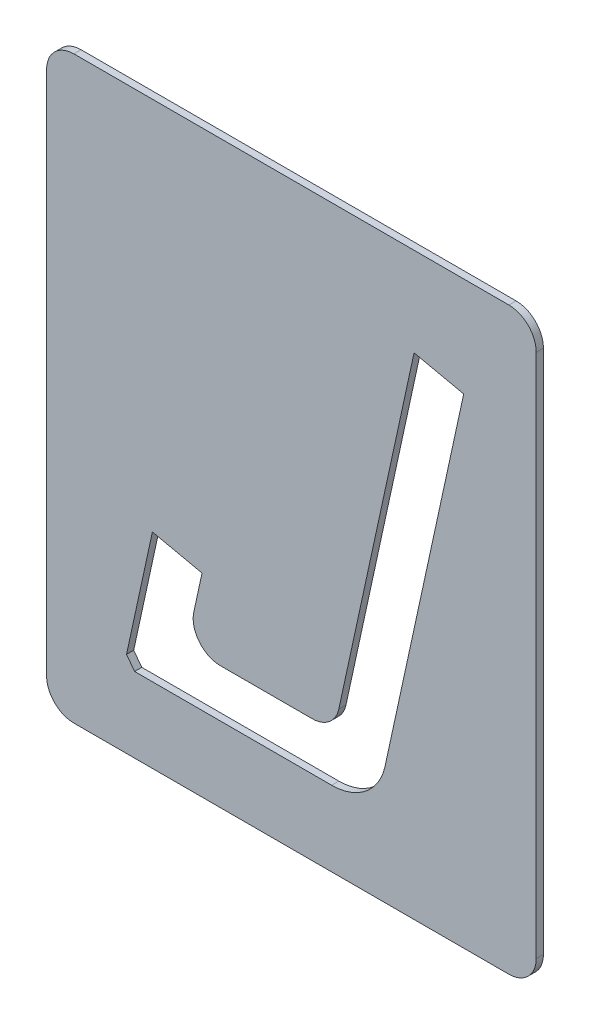
ISO-10303-21;
HEADER;
FILE_DESCRIPTION(('STEP AP214'),'2;1');
FILE_NAME('part.step','',(''),(''),'','','');
FILE_SCHEMA(('AUTOMOTIVE_DESIGN { 1 0 10303 214 1 1 1 1 }'));
ENDSEC;
DATA;
#1=APPLICATION_CONTEXT('core data for automotive mechanical design processes');
#2=APPLICATION_PROTOCOL_DEFINITION('international standard','automotive_design',2000,#1);
#3=PRODUCT_CONTEXT('',#1,'mechanical');
#4=PRODUCT('Part','Part','',(#3));
#5=PRODUCT_RELATED_PRODUCT_CATEGORY('part','',(#4));
#6=PRODUCT_DEFINITION_FORMATION('','',#4);
#7=PRODUCT_DEFINITION_CONTEXT('part definition',#1,'design');
#8=PRODUCT_DEFINITION('design','',#6,#7);
#9=PRODUCT_DEFINITION_SHAPE('','',#8);
#10=(LENGTH_UNIT() NAMED_UNIT(*) SI_UNIT(.MILLI.,.METRE.));
#11=(NAMED_UNIT(*) PLANE_ANGLE_UNIT() SI_UNIT($,.RADIAN.));
#12=(NAMED_UNIT(*) SI_UNIT($,.STERADIAN.) SOLID_ANGLE_UNIT());
#13=UNCERTAINTY_MEASURE_WITH_UNIT(LENGTH_MEASURE(1.E-05),#10,'distance_accuracy_value','');
#14=(GEOMETRIC_REPRESENTATION_CONTEXT(3) GLOBAL_UNCERTAINTY_ASSIGNED_CONTEXT((#13)) GLOBAL_UNIT_ASSIGNED_CONTEXT((#10,
#11,#12)) REPRESENTATION_CONTEXT('',''));
#15=CARTESIAN_POINT('',(0.,0.,0.));
#16=DIRECTION('',(0.,0.,1.));
#17=DIRECTION('',(1.,0.,0.));
#18=AXIS2_PLACEMENT_3D('',#15,#16,#17);
#19=CARTESIAN_POINT('',(1.915046057981,-4.069522192612,0.));
#20=DIRECTION('',(0.,0.,1.));
#21=DIRECTION('',(1.,0.,0.));
#22=AXIS2_PLACEMENT_3D('',#19,#20,#21);
#23=PLANE('',#22);
#24=DIRECTION('',(-0.212429649393078,-0.977176362822359,0.));
#25=VECTOR('',#24,1.);
#26=CARTESIAN_POINT('',(1.721180043788,-4.188048160548,0.));
#27=LINE('',#26,#25);
#28=CARTESIAN_POINT('',(1.72118004378802,-4.18804816054789,0.));
#29=VERTEX_POINT('',#28);
#30=CARTESIAN_POINT('',(1.68512443925918,-4.35390393723904,0.));
#31=VERTEX_POINT('',#30);
#32=EDGE_CURVE('E220',#29,#31,#27,.T.);
#33=ORIENTED_EDGE('',*,*,#32,.T.);
#34=DIRECTION('',(0.598473967642059,-0.801142253320078,0.));
#35=VECTOR('',#34,1.);
#36=CARTESIAN_POINT('',(1.685124439259,-4.353903937239,0.));
#37=LINE('',#36,#35);
#38=CARTESIAN_POINT('',(1.69636514961494,-4.36895122168303,0.));
#39=VERTEX_POINT('',#38);
#40=EDGE_CURVE('E264',#31,#39,#37,.T.);
#41=ORIENTED_EDGE('',*,*,#40,.T.);
#42=DIRECTION('',(1.,0.,0.));
#43=VECTOR('',#42,1.);
#44=CARTESIAN_POINT('',(1.696365149615,-4.368951221683,0.));
#45=LINE('',#44,#43);
#46=CARTESIAN_POINT('',(1.971141509953,-4.368951221683,0.));
#47=VERTEX_POINT('',#46);
#48=EDGE_CURVE('E258',#39,#47,#45,.T.);
#49=ORIENTED_EDGE('',*,*,#48,.T.);
#50=CARTESIAN_POINT('',(1.971141509953,-4.292751221683,0.));
#51=DIRECTION('',(0.,0.,1.));
#52=DIRECTION('',(1.,0.,0.));
#53=AXIS2_PLACEMENT_3D('',#50,#51,#52);
#54=CIRCLE('',#53,0.0762);
#55=CARTESIAN_POINT('',(2.04560234880003,-4.30893836096638,0.));
#56=VERTEX_POINT('',#55);
#57=EDGE_CURVE('E221',#47,#56,#54,.T.);
#58=ORIENTED_EDGE('',*,*,#57,.T.);
#59=DIRECTION('',(0.212429649393078,0.977176362822359,0.));
#60=VECTOR('',#59,1.);
#61=CARTESIAN_POINT('',(2.0456023488,-4.308938360966,0.));
#62=LINE('',#61,#60);
#63=CARTESIAN_POINT('',(2.15529760165584,-3.80434021042197,0.));
#64=VERTEX_POINT('',#63);
#65=EDGE_CURVE('E269',#56,#64,#62,.T.);
#66=ORIENTED_EDGE('',*,*,#65,.T.);
#67=DIRECTION('',(-0.977176362822359,0.212429649393078,0.));
#68=VECTOR('',#67,1.);
#69=CARTESIAN_POINT('',(2.155297601656,-3.804340210422,0.));
#70=LINE('',#69,#68);
#71=CARTESIAN_POINT('',(2.08608009494308,-3.78929292597865,0.));
#72=VERTEX_POINT('',#71);
#73=EDGE_CURVE('E275',#64,#72,#70,.T.);
#74=ORIENTED_EDGE('',*,*,#73,.T.);
#75=DIRECTION('',(-0.212429649393078,-0.977176362822359,0.));
#76=VECTOR('',#75,1.);
#77=CARTESIAN_POINT('',(2.086080094943,-3.789292925979,0.));
#78=LINE('',#77,#76);
#79=CARTESIAN_POINT('',(1.98110241524555,-4.27219024053639,0.));
#80=VERTEX_POINT('',#79);
#81=EDGE_CURVE('E281',#72,#80,#78,.T.);
#82=ORIENTED_EDGE('',*,*,#81,.T.);
#83=CARTESIAN_POINT('',(1.943871995822,-4.264096670895,0.));
#84=DIRECTION('',(0.,0.,1.));
#85=DIRECTION('',(1.,0.,0.));
#86=AXIS2_PLACEMENT_3D('',#83,#84,#85);
#87=CIRCLE('',#86,0.0381);
#88=CARTESIAN_POINT('',(1.943871995822,-4.302196670895,0.));
#89=VERTEX_POINT('',#88);
#90=EDGE_CURVE('E226',#89,#80,#87,.T.);
#91=ORIENTED_EDGE('',*,*,#90,.F.);
#92=DIRECTION('',(1.,0.,0.));
#93=VECTOR('',#92,1.);
#94=CARTESIAN_POINT('',(1.943871995822,-4.302196670895,0.));
#95=LINE('',#94,#93);
#96=CARTESIAN_POINT('',(1.816126305232,-4.302196670895,0.));
#97=VERTEX_POINT('',#96);
#98=EDGE_CURVE('E229',#89,#97,#95,.F.);
#99=ORIENTED_EDGE('',*,*,#98,.T.);
#100=CARTESIAN_POINT('',(1.816126305232,-4.264096670895,0.));
#101=DIRECTION('',(0.,0.,1.));
#102=DIRECTION('',(1.,0.,0.));
#103=AXIS2_PLACEMENT_3D('',#100,#101,#102);
#104=CIRCLE('',#103,0.0381);
#105=CARTESIAN_POINT('',(1.77889588580823,-4.25600310125306,0.));
#106=VERTEX_POINT('',#105);
#107=EDGE_CURVE('E230',#106,#97,#104,.T.);
#108=ORIENTED_EDGE('',*,*,#107,.F.);
#109=DIRECTION('',(0.212429649393078,0.977176362822359,0.));
#110=VECTOR('',#109,1.);
#111=CARTESIAN_POINT('',(1.778895885808,-4.256003101253,0.));
#112=LINE('',#111,#110);
#113=CARTESIAN_POINT('',(1.79039755049988,-4.20309544499097,0.));
#114=VERTEX_POINT('',#113);
#115=EDGE_CURVE('E233',#106,#114,#112,.T.);
#116=ORIENTED_EDGE('',*,*,#115,.T.);
#117=DIRECTION('',(-0.977176362822359,0.212429649393078,0.));
#118=VECTOR('',#117,1.);
#119=CARTESIAN_POINT('',(1.7903975505,-4.203095444991,0.));
#120=LINE('',#119,#118);
#121=EDGE_CURVE('E248',#114,#29,#120,.T.);
#122=ORIENTED_EDGE('',*,*,#121,.T.);
#123=EDGE_LOOP('',(#33,#41,#49,#58,#66,#74,#82,#91,#99,#108,#116,#122));
#124=FACE_BOUND('',#123,.T.);
#125=DIRECTION('',(1.,0.,0.));
#126=VECTOR('',#125,1.);
#127=CARTESIAN_POINT('',(2.21837797732,-3.66537829581,0.));
#128=LINE('',#127,#126);
#129=CARTESIAN_POINT('',(2.21837797732,-3.66537829581,0.));
#130=VERTEX_POINT('',#129);
#131=CARTESIAN_POINT('',(1.611714138642,-3.66537829581,0.));
#132=VERTEX_POINT('',#131);
#133=EDGE_CURVE('E153',#130,#132,#128,.F.);
#134=ORIENTED_EDGE('',*,*,#133,.F.);
#135=CARTESIAN_POINT('',(2.21837797732,-3.70347829581,0.));
#136=DIRECTION('',(0.,0.,1.));
#137=DIRECTION('',(1.,0.,0.));
#138=AXIS2_PLACEMENT_3D('',#135,#136,#137);
#139=CIRCLE('',#138,0.0381);
#140=CARTESIAN_POINT('',(2.25647797732,-3.70347829581,0.));
#141=VERTEX_POINT('',#140);
#142=EDGE_CURVE('E174',#141,#130,#139,.T.);
#143=ORIENTED_EDGE('',*,*,#142,.F.);
#144=DIRECTION('',(0.,1.,0.));
#145=VECTOR('',#144,1.);
#146=CARTESIAN_POINT('',(2.25647797732,-4.435566089415,0.));
#147=LINE('',#146,#145);
#148=CARTESIAN_POINT('',(2.25647797732,-4.435566089415,0.));
#149=VERTEX_POINT('',#148);
#150=EDGE_CURVE('E180',#149,#141,#147,.T.);
#151=ORIENTED_EDGE('',*,*,#150,.F.);
#152=CARTESIAN_POINT('',(2.21837797732,-4.435566089415,0.));
#153=DIRECTION('',(0.,0.,1.));
#154=DIRECTION('',(1.,0.,0.));
#155=AXIS2_PLACEMENT_3D('',#152,#153,#154);
#156=CIRCLE('',#155,0.0381);
#157=CARTESIAN_POINT('',(2.21837797732,-4.473666089415,0.));
#158=VERTEX_POINT('',#157);
#159=EDGE_CURVE('E235',#158,#149,#156,.T.);
#160=ORIENTED_EDGE('',*,*,#159,.F.);
#161=DIRECTION('',(1.,0.,0.));
#162=VECTOR('',#161,1.);
#163=CARTESIAN_POINT('',(1.611714138642,-4.473666089415,0.));
#164=LINE('',#163,#162);
#165=CARTESIAN_POINT('',(1.611714138642,-4.473666089415,0.));
#166=VERTEX_POINT('',#165);
#167=EDGE_CURVE('E185',#166,#158,#164,.T.);
#168=ORIENTED_EDGE('',*,*,#167,.F.);
#169=CARTESIAN_POINT('',(1.611714138642,-4.435566089415,0.));
#170=DIRECTION('',(0.,0.,1.));
#171=DIRECTION('',(1.,0.,0.));
#172=AXIS2_PLACEMENT_3D('',#169,#170,#171);
#173=CIRCLE('',#172,0.0381);
#174=CARTESIAN_POINT('',(1.573614138642,-4.435566089415,0.));
#175=VERTEX_POINT('',#174);
#176=EDGE_CURVE('E237',#175,#166,#173,.T.);
#177=ORIENTED_EDGE('',*,*,#176,.F.);
#178=DIRECTION('',(0.,1.,0.));
#179=VECTOR('',#178,1.);
#180=CARTESIAN_POINT('',(1.573614138642,-3.70347829581,0.));
#181=LINE('',#180,#179);
#182=CARTESIAN_POINT('',(1.573614138642,-3.70347829581,0.));
#183=VERTEX_POINT('',#182);
#184=EDGE_CURVE('E156',#183,#175,#181,.F.);
#185=ORIENTED_EDGE('',*,*,#184,.F.);
#186=CARTESIAN_POINT('',(1.611714138642,-3.70347829581,0.));
#187=DIRECTION('',(0.,0.,1.));
#188=DIRECTION('',(1.,0.,0.));
#189=AXIS2_PLACEMENT_3D('',#186,#187,#188);
#190=CIRCLE('',#189,0.0381);
#191=EDGE_CURVE('E20',#132,#183,#190,.T.);
#192=ORIENTED_EDGE('',*,*,#191,.F.);
#193=EDGE_LOOP('',(#134,#143,#151,#160,#168,#177,#185,#192));
#194=FACE_BOUND('',#193,.T.);
#195=ADVANCED_FACE('F17',(#124,#194),#23,.F.);
#196=CARTESIAN_POINT('',(1.611714138642,-3.70347829581,0.));
#197=DIRECTION('',(0.,0.,1.));
#198=DIRECTION('',(1.,0.,0.));
#199=AXIS2_PLACEMENT_3D('',#196,#197,#198);
#200=CYLINDRICAL_SURFACE('',#199,0.0381);
#201=CARTESIAN_POINT('',(1.611714138642,-3.70347829581,0.01));
#202=DIRECTION('',(0.,0.,1.));
#203=DIRECTION('',(1.,0.,0.));
#204=AXIS2_PLACEMENT_3D('',#201,#202,#203);
#205=CIRCLE('',#204,0.0381);
#206=CARTESIAN_POINT('',(1.611714138642,-3.66537829581,0.01));
#207=VERTEX_POINT('',#206);
#208=CARTESIAN_POINT('',(1.573614138642,-3.70347829581,0.01));
#209=VERTEX_POINT('',#208);
#210=EDGE_CURVE('E163',#207,#209,#205,.T.);
#211=ORIENTED_EDGE('',*,*,#210,.F.);
#212=DIRECTION('',(0.,0.,1.));
#213=VECTOR('',#212,1.);
#214=CARTESIAN_POINT('',(1.611714138642,-3.66537829581,0.));
#215=LINE('',#214,#213);
#216=EDGE_CURVE('E160',#132,#207,#215,.T.);
#217=ORIENTED_EDGE('',*,*,#216,.F.);
#218=ORIENTED_EDGE('',*,*,#191,.T.);
#219=DIRECTION('',(0.,0.,1.));
#220=VECTOR('',#219,1.);
#221=CARTESIAN_POINT('',(1.573614138642,-3.70347829581,0.));
#222=LINE('',#221,#220);
#223=EDGE_CURVE('E191',#209,#183,#222,.F.);
#224=ORIENTED_EDGE('',*,*,#223,.F.);
#225=EDGE_LOOP('',(#211,#217,#218,#224));
#226=FACE_BOUND('',#225,.T.);
#227=ADVANCED_FACE('F161',(#226),#200,.T.);
#228=CARTESIAN_POINT('',(1.573614138642,-3.70347829581,0.));
#229=DIRECTION('',(-1.,0.,0.));
#230=DIRECTION('',(0.,0.,1.));
#231=AXIS2_PLACEMENT_3D('',#228,#229,#230);
#232=PLANE('',#231);
#233=DIRECTION('',(0.,1.,0.));
#234=VECTOR('',#233,1.);
#235=CARTESIAN_POINT('',(1.573614138642,-4.069522192612,0.01));
#236=LINE('',#235,#234);
#237=CARTESIAN_POINT('',(1.573614138642,-4.435566089415,0.01));
#238=VERTEX_POINT('',#237);
#239=EDGE_CURVE('E218',#209,#238,#236,.F.);
#240=ORIENTED_EDGE('',*,*,#239,.F.);
#241=ORIENTED_EDGE('',*,*,#223,.T.);
#242=ORIENTED_EDGE('',*,*,#184,.T.);
#243=DIRECTION('',(0.,0.,1.));
#244=VECTOR('',#243,1.);
#245=CARTESIAN_POINT('',(1.573614138642,-4.435566089415,0.));
#246=LINE('',#245,#244);
#247=EDGE_CURVE('E189',#238,#175,#246,.F.);
#248=ORIENTED_EDGE('',*,*,#247,.F.);
#249=EDGE_LOOP('',(#240,#241,#242,#248));
#250=FACE_BOUND('',#249,.T.);
#251=ADVANCED_FACE('F574',(#250),#232,.T.);
#252=CARTESIAN_POINT('',(1.611714138642,-4.435566089415,0.));
#253=DIRECTION('',(0.,0.,1.));
#254=DIRECTION('',(1.,0.,0.));
#255=AXIS2_PLACEMENT_3D('',#252,#253,#254);
#256=CYLINDRICAL_SURFACE('',#255,0.0381);
#257=CARTESIAN_POINT('',(1.611714138642,-4.435566089415,0.01));
#258=DIRECTION('',(0.,0.,1.));
#259=DIRECTION('',(1.,0.,0.));
#260=AXIS2_PLACEMENT_3D('',#257,#258,#259);
#261=CIRCLE('',#260,0.0381);
#262=CARTESIAN_POINT('',(1.611714138642,-4.473666089415,0.01));
#263=VERTEX_POINT('',#262);
#264=EDGE_CURVE('E215',#238,#263,#261,.T.);
#265=ORIENTED_EDGE('',*,*,#264,.F.);
#266=ORIENTED_EDGE('',*,*,#247,.T.);
#267=ORIENTED_EDGE('',*,*,#176,.T.);
#268=DIRECTION('',(0.,0.,-1.));
#269=VECTOR('',#268,1.);
#270=CARTESIAN_POINT('',(1.611714138642,-4.473666089415,0.));
#271=LINE('',#270,#269);
#272=EDGE_CURVE('E188',#263,#166,#271,.T.);
#273=ORIENTED_EDGE('',*,*,#272,.F.);
#274=EDGE_LOOP('',(#265,#266,#267,#273));
#275=FACE_BOUND('',#274,.T.);
#276=ADVANCED_FACE('F321',(#275),#256,.T.);
#277=CARTESIAN_POINT('',(1.611714138642,-4.473666089415,0.));
#278=DIRECTION('',(0.,-1.,0.));
#279=DIRECTION('',(0.,0.,-1.));
#280=AXIS2_PLACEMENT_3D('',#277,#278,#279);
#281=PLANE('',#280);
#282=DIRECTION('',(1.,0.,0.));
#283=VECTOR('',#282,1.);
#284=CARTESIAN_POINT('',(1.915046057981,-4.473666089415,0.01));
#285=LINE('',#284,#283);
#286=CARTESIAN_POINT('',(2.21837797732,-4.473666089415,0.01));
#287=VERTEX_POINT('',#286);
#288=EDGE_CURVE('E214',#263,#287,#285,.T.);
#289=ORIENTED_EDGE('',*,*,#288,.F.);
#290=ORIENTED_EDGE('',*,*,#272,.T.);
#291=ORIENTED_EDGE('',*,*,#167,.T.);
#292=DIRECTION('',(0.,0.,1.));
#293=VECTOR('',#292,1.);
#294=CARTESIAN_POINT('',(2.21837797732,-4.473666089415,0.));
#295=LINE('',#294,#293);
#296=EDGE_CURVE('E184',#287,#158,#295,.F.);
#297=ORIENTED_EDGE('',*,*,#296,.F.);
#298=EDGE_LOOP('',(#289,#290,#291,#297));
#299=FACE_BOUND('',#298,.T.);
#300=ADVANCED_FACE('F318',(#299),#281,.T.);
#301=CARTESIAN_POINT('',(2.21837797732,-4.435566089415,0.));
#302=DIRECTION('',(0.,0.,1.));
#303=DIRECTION('',(1.,0.,0.));
#304=AXIS2_PLACEMENT_3D('',#301,#302,#303);
#305=CYLINDRICAL_SURFACE('',#304,0.0381);
#306=CARTESIAN_POINT('',(2.21837797732,-4.435566089415,0.01));
#307=DIRECTION('',(0.,0.,1.));
#308=DIRECTION('',(1.,0.,0.));
#309=AXIS2_PLACEMENT_3D('',#306,#307,#308);
#310=CIRCLE('',#309,0.0381);
#311=CARTESIAN_POINT('',(2.25647797732,-4.435566089415,0.01));
#312=VERTEX_POINT('',#311);
#313=EDGE_CURVE('E211',#287,#312,#310,.T.);
#314=ORIENTED_EDGE('',*,*,#313,.F.);
#315=ORIENTED_EDGE('',*,*,#296,.T.);
#316=ORIENTED_EDGE('',*,*,#159,.T.);
#317=DIRECTION('',(0.,0.,-1.));
#318=VECTOR('',#317,1.);
#319=CARTESIAN_POINT('',(2.25647797732,-4.435566089415,0.));
#320=LINE('',#319,#318);
#321=EDGE_CURVE('E183',#312,#149,#320,.T.);
#322=ORIENTED_EDGE('',*,*,#321,.F.);
#323=EDGE_LOOP('',(#314,#315,#316,#322));
#324=FACE_BOUND('',#323,.T.);
#325=ADVANCED_FACE('F416',(#324),#305,.T.);
#326=CARTESIAN_POINT('',(2.25647797732,-4.435566089415,0.));
#327=DIRECTION('',(1.,0.,0.));
#328=DIRECTION('',(0.,0.,-1.));
#329=AXIS2_PLACEMENT_3D('',#326,#327,#328);
#330=PLANE('',#329);
#331=DIRECTION('',(0.,1.,0.));
#332=VECTOR('',#331,1.);
#333=CARTESIAN_POINT('',(2.25647797732,-4.069522192612,0.01));
#334=LINE('',#333,#332);
#335=CARTESIAN_POINT('',(2.25647797732,-3.70347829581,0.01));
#336=VERTEX_POINT('',#335);
#337=EDGE_CURVE('E210',#312,#336,#334,.T.);
#338=ORIENTED_EDGE('',*,*,#337,.F.);
#339=ORIENTED_EDGE('',*,*,#321,.T.);
#340=ORIENTED_EDGE('',*,*,#150,.T.);
#341=DIRECTION('',(0.,0.,1.));
#342=VECTOR('',#341,1.);
#343=CARTESIAN_POINT('',(2.25647797732,-3.70347829581,0.));
#344=LINE('',#343,#342);
#345=EDGE_CURVE('E171',#336,#141,#344,.F.);
#346=ORIENTED_EDGE('',*,*,#345,.F.);
#347=EDGE_LOOP('',(#338,#339,#340,#346));
#348=FACE_BOUND('',#347,.T.);
#349=ADVANCED_FACE('F412',(#348),#330,.T.);
#350=CARTESIAN_POINT('',(2.21837797732,-3.70347829581,0.));
#351=DIRECTION('',(0.,0.,1.));
#352=DIRECTION('',(1.,0.,0.));
#353=AXIS2_PLACEMENT_3D('',#350,#351,#352);
#354=CYLINDRICAL_SURFACE('',#353,0.0381);
#355=CARTESIAN_POINT('',(2.21837797732,-3.70347829581,0.01));
#356=DIRECTION('',(0.,0.,1.));
#357=DIRECTION('',(1.,0.,0.));
#358=AXIS2_PLACEMENT_3D('',#355,#356,#357);
#359=CIRCLE('',#358,0.0381);
#360=CARTESIAN_POINT('',(2.21837797732,-3.66537829581,0.01));
#361=VERTEX_POINT('',#360);
#362=EDGE_CURVE('E206',#336,#361,#359,.T.);
#363=ORIENTED_EDGE('',*,*,#362,.F.);
#364=ORIENTED_EDGE('',*,*,#345,.T.);
#365=ORIENTED_EDGE('',*,*,#142,.T.);
#366=DIRECTION('',(0.,0.,1.));
#367=VECTOR('',#366,1.);
#368=CARTESIAN_POINT('',(2.21837797732,-3.66537829581,0.));
#369=LINE('',#368,#367);
#370=EDGE_CURVE('E167',#361,#130,#369,.F.);
#371=ORIENTED_EDGE('',*,*,#370,.F.);
#372=EDGE_LOOP('',(#363,#364,#365,#371));
#373=FACE_BOUND('',#372,.T.);
#374=ADVANCED_FACE('F414',(#373),#354,.T.);
#375=CARTESIAN_POINT('',(2.21837797732,-3.66537829581,0.));
#376=DIRECTION('',(0.,1.,0.));
#377=DIRECTION('',(0.,0.,1.));
#378=AXIS2_PLACEMENT_3D('',#375,#376,#377);
#379=PLANE('',#378);
#380=DIRECTION('',(1.,0.,0.));
#381=VECTOR('',#380,1.);
#382=CARTESIAN_POINT('',(1.915046057981,-3.66537829581,0.01));
#383=LINE('',#382,#381);
#384=EDGE_CURVE('E209',#361,#207,#383,.F.);
#385=ORIENTED_EDGE('',*,*,#384,.F.);
#386=ORIENTED_EDGE('',*,*,#370,.T.);
#387=ORIENTED_EDGE('',*,*,#133,.T.);
#388=ORIENTED_EDGE('',*,*,#216,.T.);
#389=EDGE_LOOP('',(#385,#386,#387,#388));
#390=FACE_BOUND('',#389,.T.);
#391=ADVANCED_FACE('F170',(#390),#379,.T.);
#392=CARTESIAN_POINT('',(1.7903975505,-4.203095444991,0.));
#393=DIRECTION('',(0.212429649393078,0.977176362822359,0.));
#394=DIRECTION('',(-0.977176362822359,0.212429649393078,0.));
#395=AXIS2_PLACEMENT_3D('',#392,#393,#394);
#396=PLANE('',#395);
#397=DIRECTION('',(0.,0.,1.));
#398=VECTOR('',#397,1.);
#399=CARTESIAN_POINT('',(1.79039755049982,-4.20309544499096,0.));
#400=LINE('',#399,#398);
#401=CARTESIAN_POINT('',(1.79039755049994,-4.20309544499099,0.01));
#402=VERTEX_POINT('',#401);
#403=EDGE_CURVE('E250',#114,#402,#400,.T.);
#404=ORIENTED_EDGE('',*,*,#403,.T.);
#405=DIRECTION('',(0.977176362823345,-0.212429649388542,0.));
#406=VECTOR('',#405,1.);
#407=CARTESIAN_POINT('',(1.721180043788,-4.188048160548,0.01));
#408=LINE('',#407,#406);
#409=CARTESIAN_POINT('',(1.721180043788,-4.188048160548,0.01));
#410=VERTEX_POINT('',#409);
#411=EDGE_CURVE('E301',#410,#402,#408,.T.);
#412=ORIENTED_EDGE('',*,*,#411,.F.);
#413=DIRECTION('',(0.,0.,1.));
#414=VECTOR('',#413,1.);
#415=CARTESIAN_POINT('',(1.721180043788,-4.188048160548,0.));
#416=LINE('',#415,#414);
#417=EDGE_CURVE('E255',#410,#29,#416,.F.);
#418=ORIENTED_EDGE('',*,*,#417,.T.);
#419=ORIENTED_EDGE('',*,*,#121,.F.);
#420=EDGE_LOOP('',(#404,#412,#418,#419));
#421=FACE_BOUND('',#420,.T.);
#422=ADVANCED_FACE('F364',(#421),#396,.F.);
#423=CARTESIAN_POINT('',(1.778895885808,-4.256003101253,0.));
#424=DIRECTION('',(0.977176362822359,-0.212429649393078,0.));
#425=DIRECTION('',(0.212429649393078,0.977176362822359,0.));
#426=AXIS2_PLACEMENT_3D('',#423,#424,#425);
#427=PLANE('',#426);
#428=DIRECTION('',(0.,0.,1.));
#429=VECTOR('',#428,1.);
#430=CARTESIAN_POINT('',(1.77889588580847,-4.2560031012531,0.));
#431=LINE('',#430,#429);
#432=CARTESIAN_POINT('',(1.77889588580825,-4.256003101253,0.01));
#433=VERTEX_POINT('',#432);
#434=EDGE_CURVE('E232',#433,#106,#431,.F.);
#435=ORIENTED_EDGE('',*,*,#434,.F.);
#436=DIRECTION('',(-0.212429649396415,-0.977176362821633,0.));
#437=VECTOR('',#436,1.);
#438=CARTESIAN_POINT('',(1.7903975505,-4.203095444991,0.01));
#439=LINE('',#438,#437);
#440=EDGE_CURVE('E205',#402,#433,#439,.T.);
#441=ORIENTED_EDGE('',*,*,#440,.F.);
#442=ORIENTED_EDGE('',*,*,#403,.F.);
#443=ORIENTED_EDGE('',*,*,#115,.F.);
#444=EDGE_LOOP('',(#435,#441,#442,#443));
#445=FACE_BOUND('',#444,.T.);
#446=ADVANCED_FACE('F360',(#445),#427,.F.);
#447=CARTESIAN_POINT('',(1.816126305232,-4.264096670895,0.));
#448=DIRECTION('',(0.,0.,1.));
#449=DIRECTION('',(1.,0.,0.));
#450=AXIS2_PLACEMENT_3D('',#447,#448,#449);
#451=CYLINDRICAL_SURFACE('',#450,0.0381);
#452=CARTESIAN_POINT('',(1.816126305232,-4.264096670895,0.01));
#453=DIRECTION('',(0.,0.,1.));
#454=DIRECTION('',(1.,0.,0.));
#455=AXIS2_PLACEMENT_3D('',#452,#453,#454);
#456=CIRCLE('',#455,0.0381);
#457=CARTESIAN_POINT('',(1.816126305232,-4.302196670895,0.01));
#458=VERTEX_POINT('',#457);
#459=EDGE_CURVE('E202',#433,#458,#456,.T.);
#460=ORIENTED_EDGE('',*,*,#459,.F.);
#461=ORIENTED_EDGE('',*,*,#434,.T.);
#462=ORIENTED_EDGE('',*,*,#107,.T.);
#463=DIRECTION('',(0.,0.,1.));
#464=VECTOR('',#463,1.);
#465=CARTESIAN_POINT('',(1.816126305232,-4.302196670895,0.));
#466=LINE('',#465,#464);
#467=EDGE_CURVE('E288',#97,#458,#466,.T.);
#468=ORIENTED_EDGE('',*,*,#467,.T.);
#469=EDGE_LOOP('',(#460,#461,#462,#468));
#470=FACE_BOUND('',#469,.T.);
#471=ADVANCED_FACE('F357',(#470),#451,.T.);
#472=CARTESIAN_POINT('',(1.943871995822,-4.302196670895,0.));
#473=DIRECTION('',(0.,1.,0.));
#474=DIRECTION('',(0.,0.,1.));
#475=AXIS2_PLACEMENT_3D('',#472,#473,#474);
#476=PLANE('',#475);
#477=DIRECTION('',(0.,0.,1.));
#478=VECTOR('',#477,1.);
#479=CARTESIAN_POINT('',(1.943871995822,-4.302196670895,0.));
#480=LINE('',#479,#478);
#481=CARTESIAN_POINT('',(1.943871995822,-4.302196670895,0.01));
#482=VERTEX_POINT('',#481);
#483=EDGE_CURVE('E228',#482,#89,#480,.F.);
#484=ORIENTED_EDGE('',*,*,#483,.F.);
#485=DIRECTION('',(1.,0.,0.));
#486=VECTOR('',#485,1.);
#487=CARTESIAN_POINT('',(1.915046057981,-4.302196670895,0.01));
#488=LINE('',#487,#486);
#489=EDGE_CURVE('E201',#458,#482,#488,.T.);
#490=ORIENTED_EDGE('',*,*,#489,.F.);
#491=ORIENTED_EDGE('',*,*,#467,.F.);
#492=ORIENTED_EDGE('',*,*,#98,.F.);
#493=EDGE_LOOP('',(#484,#490,#491,#492));
#494=FACE_BOUND('',#493,.T.);
#495=ADVANCED_FACE('F396',(#494),#476,.F.);
#496=CARTESIAN_POINT('',(1.943871995822,-4.264096670895,0.));
#497=DIRECTION('',(0.,0.,1.));
#498=DIRECTION('',(1.,0.,0.));
#499=AXIS2_PLACEMENT_3D('',#496,#497,#498);
#500=CYLINDRICAL_SURFACE('',#499,0.0381);
#501=CARTESIAN_POINT('',(1.943871995822,-4.264096670895,0.01));
#502=DIRECTION('',(0.,0.,1.));
#503=DIRECTION('',(1.,0.,0.));
#504=AXIS2_PLACEMENT_3D('',#501,#502,#503);
#505=CIRCLE('',#504,0.0381);
#506=CARTESIAN_POINT('',(1.98110241524573,-4.27219024053642,0.01));
#507=VERTEX_POINT('',#506);
#508=EDGE_CURVE('E197',#482,#507,#505,.T.);
#509=ORIENTED_EDGE('',*,*,#508,.F.);
#510=ORIENTED_EDGE('',*,*,#483,.T.);
#511=ORIENTED_EDGE('',*,*,#90,.T.);
#512=DIRECTION('',(0.,0.,1.));
#513=VECTOR('',#512,1.);
#514=CARTESIAN_POINT('',(1.98110241524565,-4.27219024053592,0.));
#515=LINE('',#514,#513);
#516=EDGE_CURVE('E284',#80,#507,#515,.T.);
#517=ORIENTED_EDGE('',*,*,#516,.T.);
#518=EDGE_LOOP('',(#509,#510,#511,#517));
#519=FACE_BOUND('',#518,.T.);
#520=ADVANCED_FACE('F398',(#519),#500,.T.);
#521=CARTESIAN_POINT('',(2.086080094943,-3.789292925979,0.));
#522=DIRECTION('',(-0.977176362822359,0.212429649393078,0.));
#523=DIRECTION('',(-0.212429649393078,-0.977176362822359,0.));
#524=AXIS2_PLACEMENT_3D('',#521,#522,#523);
#525=PLANE('',#524);
#526=DIRECTION('',(0.,0.,1.));
#527=VECTOR('',#526,1.);
#528=CARTESIAN_POINT('',(2.08608009494312,-3.78929292597847,0.));
#529=LINE('',#528,#527);
#530=CARTESIAN_POINT('',(2.08608009494304,-3.78929292597882,0.01));
#531=VERTEX_POINT('',#530);
#532=EDGE_CURVE('E278',#72,#531,#529,.T.);
#533=ORIENTED_EDGE('',*,*,#532,.T.);
#534=DIRECTION('',(0.212429649392371,0.977176362822512,0.));
#535=VECTOR('',#534,1.);
#536=CARTESIAN_POINT('',(1.981102415246,-4.272190240536,0.01));
#537=LINE('',#536,#535);
#538=EDGE_CURVE('E200',#507,#531,#537,.T.);
#539=ORIENTED_EDGE('',*,*,#538,.F.);
#540=ORIENTED_EDGE('',*,*,#516,.F.);
#541=ORIENTED_EDGE('',*,*,#81,.F.);
#542=EDGE_LOOP('',(#533,#539,#540,#541));
#543=FACE_BOUND('',#542,.T.);
#544=ADVANCED_FACE('F391',(#543),#525,.F.);
#545=CARTESIAN_POINT('',(2.155297601656,-3.804340210422,0.));
#546=DIRECTION('',(0.212429649393078,0.977176362822359,0.));
#547=DIRECTION('',(-0.977176362822359,0.212429649393078,0.));
#548=AXIS2_PLACEMENT_3D('',#545,#546,#547);
#549=PLANE('',#548);
#550=DIRECTION('',(0.,0.,1.));
#551=VECTOR('',#550,1.);
#552=CARTESIAN_POINT('',(2.15529760165576,-3.80434021042195,0.));
#553=LINE('',#552,#551);
#554=CARTESIAN_POINT('',(2.15529760165592,-3.80434021042198,0.01));
#555=VERTEX_POINT('',#554);
#556=EDGE_CURVE('E272',#64,#555,#553,.T.);
#557=ORIENTED_EDGE('',*,*,#556,.T.);
#558=DIRECTION('',(0.97717636282398,-0.212429649385618,0.));
#559=VECTOR('',#558,1.);
#560=CARTESIAN_POINT('',(2.086080094943,-3.789292925979,0.01));
#561=LINE('',#560,#559);
#562=EDGE_CURVE('E342',#531,#555,#561,.T.);
#563=ORIENTED_EDGE('',*,*,#562,.F.);
#564=ORIENTED_EDGE('',*,*,#532,.F.);
#565=ORIENTED_EDGE('',*,*,#73,.F.);
#566=EDGE_LOOP('',(#557,#563,#564,#565));
#567=FACE_BOUND('',#566,.T.);
#568=ADVANCED_FACE('F387',(#567),#549,.F.);
#569=CARTESIAN_POINT('',(2.0456023488,-4.308938360966,0.));
#570=DIRECTION('',(0.977176362822359,-0.212429649393078,0.));
#571=DIRECTION('',(0.212429649393078,0.977176362822359,0.));
#572=AXIS2_PLACEMENT_3D('',#569,#570,#571);
#573=PLANE('',#572);
#574=DIRECTION('',(0.,0.,1.));
#575=VECTOR('',#574,1.);
#576=CARTESIAN_POINT('',(2.04560234880022,-4.30893836096605,0.));
#577=LINE('',#576,#575);
#578=CARTESIAN_POINT('',(2.04560234880003,-4.30893836096639,0.01));
#579=VERTEX_POINT('',#578);
#580=EDGE_CURVE('E225',#56,#579,#577,.T.);
#581=ORIENTED_EDGE('',*,*,#580,.T.);
#582=DIRECTION('',(-0.212429649393546,-0.977176362822257,0.));
#583=VECTOR('',#582,1.);
#584=CARTESIAN_POINT('',(2.155297601656,-3.804340210422,0.01));
#585=LINE('',#584,#583);
#586=EDGE_CURVE('E196',#555,#579,#585,.T.);
#587=ORIENTED_EDGE('',*,*,#586,.F.);
#588=ORIENTED_EDGE('',*,*,#556,.F.);
#589=ORIENTED_EDGE('',*,*,#65,.F.);
#590=EDGE_LOOP('',(#581,#587,#588,#589));
#591=FACE_BOUND('',#590,.T.);
#592=ADVANCED_FACE('F384',(#591),#573,.F.);
#593=CARTESIAN_POINT('',(1.971141509953,-4.292751221683,0.));
#594=DIRECTION('',(0.,0.,1.));
#595=DIRECTION('',(1.,0.,0.));
#596=AXIS2_PLACEMENT_3D('',#593,#594,#595);
#597=CYLINDRICAL_SURFACE('',#596,0.0762);
#598=DIRECTION('',(0.,0.,-1.));
#599=VECTOR('',#598,1.);
#600=CARTESIAN_POINT('',(1.971141509953,-4.368951221683,0.));
#601=LINE('',#600,#599);
#602=CARTESIAN_POINT('',(1.971141509953,-4.368951221683,0.01));
#603=VERTEX_POINT('',#602);
#604=EDGE_CURVE('E224',#47,#603,#601,.F.);
#605=ORIENTED_EDGE('',*,*,#604,.T.);
#606=CARTESIAN_POINT('',(1.971141509953,-4.292751221683,0.01));
#607=DIRECTION('',(0.,0.,1.));
#608=DIRECTION('',(1.,0.,0.));
#609=AXIS2_PLACEMENT_3D('',#606,#607,#608);
#610=CIRCLE('',#609,0.0762);
#611=EDGE_CURVE('E192',#579,#603,#610,.F.);
#612=ORIENTED_EDGE('',*,*,#611,.F.);
#613=ORIENTED_EDGE('',*,*,#580,.F.);
#614=ORIENTED_EDGE('',*,*,#57,.F.);
#615=EDGE_LOOP('',(#605,#612,#613,#614));
#616=FACE_BOUND('',#615,.T.);
#617=ADVANCED_FACE('F377',(#616),#597,.F.);
#618=CARTESIAN_POINT('',(1.696365149615,-4.368951221683,0.));
#619=DIRECTION('',(0.,-1.,0.));
#620=DIRECTION('',(0.,0.,-1.));
#621=AXIS2_PLACEMENT_3D('',#618,#619,#620);
#622=PLANE('',#621);
#623=DIRECTION('',(0.,0.,1.));
#624=VECTOR('',#623,1.);
#625=CARTESIAN_POINT('',(1.69636514961493,-4.36895122168305,0.));
#626=LINE('',#625,#624);
#627=CARTESIAN_POINT('',(1.69636514961498,-4.36895122168302,0.01));
#628=VERTEX_POINT('',#627);
#629=EDGE_CURVE('E261',#39,#628,#626,.T.);
#630=ORIENTED_EDGE('',*,*,#629,.T.);
#631=DIRECTION('',(1.,0.,0.));
#632=VECTOR('',#631,1.);
#633=CARTESIAN_POINT('',(1.915046057981,-4.368951221683,0.01));
#634=LINE('',#633,#632);
#635=EDGE_CURVE('E195',#603,#628,#634,.F.);
#636=ORIENTED_EDGE('',*,*,#635,.F.);
#637=ORIENTED_EDGE('',*,*,#604,.F.);
#638=ORIENTED_EDGE('',*,*,#48,.F.);
#639=EDGE_LOOP('',(#630,#636,#637,#638));
#640=FACE_BOUND('',#639,.T.);
#641=ADVANCED_FACE('F374',(#640),#622,.F.);
#642=CARTESIAN_POINT('',(1.685124439259,-4.353903937239,0.));
#643=DIRECTION('',(-0.801142253320078,-0.598473967642059,0.));
#644=DIRECTION('',(0.598473967642059,-0.801142253320078,0.));
#645=AXIS2_PLACEMENT_3D('',#642,#643,#644);
#646=PLANE('',#645);
#647=DIRECTION('',(0.,0.,1.));
#648=VECTOR('',#647,1.);
#649=CARTESIAN_POINT('',(1.68512443925971,-4.35390393723915,0.));
#650=LINE('',#649,#648);
#651=CARTESIAN_POINT('',(1.68512443925918,-4.35390393723904,0.01));
#652=VERTEX_POINT('',#651);
#653=EDGE_CURVE('E35',#31,#652,#650,.T.);
#654=ORIENTED_EDGE('',*,*,#653,.T.);
#655=DIRECTION('',(-0.598473967645678,0.801142253317374,0.));
#656=VECTOR('',#655,1.);
#657=CARTESIAN_POINT('',(1.696365149615,-4.368951221683,0.01));
#658=LINE('',#657,#656);
#659=EDGE_CURVE('E26',#628,#652,#658,.T.);
#660=ORIENTED_EDGE('',*,*,#659,.F.);
#661=ORIENTED_EDGE('',*,*,#629,.F.);
#662=ORIENTED_EDGE('',*,*,#40,.F.);
#663=EDGE_LOOP('',(#654,#660,#661,#662));
#664=FACE_BOUND('',#663,.T.);
#665=ADVANCED_FACE('F370',(#664),#646,.F.);
#666=CARTESIAN_POINT('',(1.721180043788,-4.188048160548,0.));
#667=DIRECTION('',(-0.977176362822359,0.212429649393078,0.));
#668=DIRECTION('',(-0.212429649393078,-0.977176362822359,0.));
#669=AXIS2_PLACEMENT_3D('',#666,#667,#668);
#670=PLANE('',#669);
#671=ORIENTED_EDGE('',*,*,#417,.F.);
#672=DIRECTION('',(0.212429649397246,0.977176362821453,0.));
#673=VECTOR('',#672,1.);
#674=CARTESIAN_POINT('',(1.685124439259,-4.353903937239,0.01));
#675=LINE('',#674,#673);
#676=EDGE_CURVE('E11',#652,#410,#675,.T.);
#677=ORIENTED_EDGE('',*,*,#676,.F.);
#678=ORIENTED_EDGE('',*,*,#653,.F.);
#679=ORIENTED_EDGE('',*,*,#32,.F.);
#680=EDGE_LOOP('',(#671,#677,#678,#679));
#681=FACE_BOUND('',#680,.T.);
#682=ADVANCED_FACE('F367',(#681),#670,.F.);
#683=CARTESIAN_POINT('',(1.915046057981,-4.069522192612,0.01));
#684=DIRECTION('',(0.,0.,1.));
#685=DIRECTION('',(1.,0.,0.));
#686=AXIS2_PLACEMENT_3D('',#683,#684,#685);
#687=PLANE('',#686);
#688=ORIENTED_EDGE('',*,*,#659,.T.);
#689=ORIENTED_EDGE('',*,*,#676,.T.);
#690=ORIENTED_EDGE('',*,*,#411,.T.);
#691=ORIENTED_EDGE('',*,*,#440,.T.);
#692=ORIENTED_EDGE('',*,*,#459,.T.);
#693=ORIENTED_EDGE('',*,*,#489,.T.);
#694=ORIENTED_EDGE('',*,*,#508,.T.);
#695=ORIENTED_EDGE('',*,*,#538,.T.);
#696=ORIENTED_EDGE('',*,*,#562,.T.);
#697=ORIENTED_EDGE('',*,*,#586,.T.);
#698=ORIENTED_EDGE('',*,*,#611,.T.);
#699=ORIENTED_EDGE('',*,*,#635,.T.);
#700=EDGE_LOOP('',(#688,#689,#690,#691,#692,#693,#694,#695,#696,#697,#698,#699));
#701=FACE_BOUND('',#700,.T.);
#702=ORIENTED_EDGE('',*,*,#362,.T.);
#703=ORIENTED_EDGE('',*,*,#384,.T.);
#704=ORIENTED_EDGE('',*,*,#210,.T.);
#705=ORIENTED_EDGE('',*,*,#239,.T.);
#706=ORIENTED_EDGE('',*,*,#264,.T.);
#707=ORIENTED_EDGE('',*,*,#288,.T.);
#708=ORIENTED_EDGE('',*,*,#313,.T.);
#709=ORIENTED_EDGE('',*,*,#337,.T.);
#710=EDGE_LOOP('',(#702,#703,#704,#705,#706,#707,#708,#709));
#711=FACE_BOUND('',#710,.T.);
#712=ADVANCED_FACE('F324',(#701,#711),#687,.T.);
#713=CLOSED_SHELL('',(#195,#227,#251,#276,#300,#325,#349,#374,#391,#422,#446,#471,#495,#520,
#544,#568,#592,#617,#641,#665,#682,#712));
#714=MANIFOLD_SOLID_BREP('B1',#713);
#715=ADVANCED_BREP_SHAPE_REPRESENTATION('',(#18,#714),#14);
#716=SHAPE_DEFINITION_REPRESENTATION(#9,#715);
ENDSEC;
END-ISO-10303-21;
